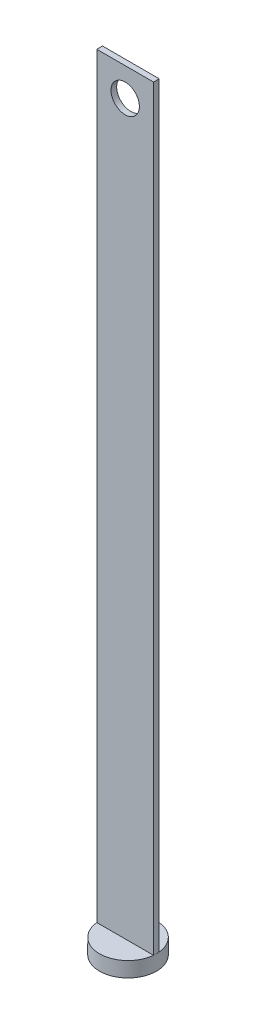
ISO-10303-21;
HEADER;
FILE_DESCRIPTION(('STEP AP214'),'2;1');
FILE_NAME('part.step','',(''),(''),'','','');
FILE_SCHEMA(('AUTOMOTIVE_DESIGN { 1 0 10303 214 1 1 1 1 }'));
ENDSEC;
DATA;
#1=APPLICATION_CONTEXT('core data for automotive mechanical design processes');
#2=APPLICATION_PROTOCOL_DEFINITION('international standard','automotive_design',2000,#1);
#3=PRODUCT_CONTEXT('',#1,'mechanical');
#4=PRODUCT('Part','Part','',(#3));
#5=PRODUCT_RELATED_PRODUCT_CATEGORY('part','',(#4));
#6=PRODUCT_DEFINITION_FORMATION('','',#4);
#7=PRODUCT_DEFINITION_CONTEXT('part definition',#1,'design');
#8=PRODUCT_DEFINITION('design','',#6,#7);
#9=PRODUCT_DEFINITION_SHAPE('','',#8);
#10=(LENGTH_UNIT() NAMED_UNIT(*) SI_UNIT(.MILLI.,.METRE.));
#11=(NAMED_UNIT(*) PLANE_ANGLE_UNIT() SI_UNIT($,.RADIAN.));
#12=(NAMED_UNIT(*) SI_UNIT($,.STERADIAN.) SOLID_ANGLE_UNIT());
#13=UNCERTAINTY_MEASURE_WITH_UNIT(LENGTH_MEASURE(1.E-05),#10,'distance_accuracy_value','');
#14=(GEOMETRIC_REPRESENTATION_CONTEXT(3) GLOBAL_UNCERTAINTY_ASSIGNED_CONTEXT((#13)) GLOBAL_UNIT_ASSIGNED_CONTEXT((#10,
#11,#12)) REPRESENTATION_CONTEXT('',''));
#15=CARTESIAN_POINT('',(0.,0.,0.));
#16=DIRECTION('',(0.,0.,1.));
#17=DIRECTION('',(1.,0.,0.));
#18=AXIS2_PLACEMENT_3D('',#15,#16,#17);
#19=CARTESIAN_POINT('',(-222.813580857681,446.46274670861,3.));
#20=DIRECTION('',(1.,0.,0.));
#21=DIRECTION('',(0.,1.,0.));
#22=AXIS2_PLACEMENT_3D('',#19,#20,#21);
#23=PLANE('',#22);
#24=DIRECTION('',(0.,-1.,0.));
#25=VECTOR('',#24,1.);
#26=CARTESIAN_POINT('',(-222.813580857681,446.46274670861,0.));
#27=LINE('',#26,#25);
#28=CARTESIAN_POINT('',(-222.813580857681,446.46274670861,0.));
#29=VERTEX_POINT('',#28);
#30=CARTESIAN_POINT('',(-222.813580857681,46.4627467086098,0.));
#31=VERTEX_POINT('',#30);
#32=EDGE_CURVE('E82',#29,#31,#27,.T.);
#33=ORIENTED_EDGE('',*,*,#32,.T.);
#34=DIRECTION('',(0.,0.,-1.));
#35=VECTOR('',#34,1.);
#36=CARTESIAN_POINT('',(-222.813580857681,46.4627467086098,3.));
#37=LINE('',#36,#35);
#38=CARTESIAN_POINT('',(-222.813580857681,46.4627467086098,3.));
#39=VERTEX_POINT('',#38);
#40=EDGE_CURVE('E11',#39,#31,#37,.T.);
#41=ORIENTED_EDGE('',*,*,#40,.F.);
#42=DIRECTION('',(0.,-1.,0.));
#43=VECTOR('',#42,1.);
#44=CARTESIAN_POINT('',(-222.813580857681,446.46274670861,3.));
#45=LINE('',#44,#43);
#46=CARTESIAN_POINT('',(-222.813580857681,446.46274670861,3.));
#47=VERTEX_POINT('',#46);
#48=EDGE_CURVE('E76',#47,#39,#45,.T.);
#49=ORIENTED_EDGE('',*,*,#48,.F.);
#50=DIRECTION('',(0.,0.,-1.));
#51=VECTOR('',#50,1.);
#52=CARTESIAN_POINT('',(-222.813580857681,446.46274670861,3.));
#53=LINE('',#52,#51);
#54=EDGE_CURVE('E85',#47,#29,#53,.T.);
#55=ORIENTED_EDGE('',*,*,#54,.T.);
#56=EDGE_LOOP('',(#33,#41,#49,#55));
#57=FACE_BOUND('',#56,.T.);
#58=ADVANCED_FACE('F35',(#57),#23,.F.);
#59=CARTESIAN_POINT('',(-192.813580857681,446.46274670861,3.));
#60=DIRECTION('',(-1.,0.,0.));
#61=DIRECTION('',(0.,-1.,0.));
#62=AXIS2_PLACEMENT_3D('',#59,#60,#61);
#63=PLANE('',#62);
#64=DIRECTION('',(0.,1.,0.));
#65=VECTOR('',#64,1.);
#66=CARTESIAN_POINT('',(-192.813580857681,446.46274670861,0.));
#67=LINE('',#66,#65);
#68=CARTESIAN_POINT('',(-192.813580857681,46.4627467086098,0.));
#69=VERTEX_POINT('',#68);
#70=CARTESIAN_POINT('',(-192.813580857681,446.46274670861,0.));
#71=VERTEX_POINT('',#70);
#72=EDGE_CURVE('E65',#69,#71,#67,.T.);
#73=ORIENTED_EDGE('',*,*,#72,.T.);
#74=DIRECTION('',(0.,0.,-1.));
#75=VECTOR('',#74,1.);
#76=CARTESIAN_POINT('',(-192.813580857681,446.46274670861,3.));
#77=LINE('',#76,#75);
#78=CARTESIAN_POINT('',(-192.813580857681,446.46274670861,3.));
#79=VERTEX_POINT('',#78);
#80=EDGE_CURVE('E129',#79,#71,#77,.T.);
#81=ORIENTED_EDGE('',*,*,#80,.F.);
#82=DIRECTION('',(0.,1.,0.));
#83=VECTOR('',#82,1.);
#84=CARTESIAN_POINT('',(-192.813580857681,446.46274670861,3.));
#85=LINE('',#84,#83);
#86=CARTESIAN_POINT('',(-192.813580857681,46.4627467086098,3.));
#87=VERTEX_POINT('',#86);
#88=EDGE_CURVE('E123',#87,#79,#85,.T.);
#89=ORIENTED_EDGE('',*,*,#88,.F.);
#90=DIRECTION('',(0.,0.,-1.));
#91=VECTOR('',#90,1.);
#92=CARTESIAN_POINT('',(-192.813580857681,46.4627467086098,3.));
#93=LINE('',#92,#91);
#94=EDGE_CURVE('E43',#87,#69,#93,.T.);
#95=ORIENTED_EDGE('',*,*,#94,.T.);
#96=EDGE_LOOP('',(#73,#81,#89,#95));
#97=FACE_BOUND('',#96,.T.);
#98=ADVANCED_FACE('F132',(#97),#63,.F.);
#99=CARTESIAN_POINT('',(-222.813580857681,446.46274670861,3.));
#100=DIRECTION('',(0.,-1.,0.));
#101=DIRECTION('',(0.,0.,-1.));
#102=AXIS2_PLACEMENT_3D('',#99,#100,#101);
#103=PLANE('',#102);
#104=DIRECTION('',(-1.,0.,0.));
#105=VECTOR('',#104,1.);
#106=CARTESIAN_POINT('',(-222.813580857681,446.46274670861,0.));
#107=LINE('',#106,#105);
#108=EDGE_CURVE('E71',#71,#29,#107,.T.);
#109=ORIENTED_EDGE('',*,*,#108,.T.);
#110=ORIENTED_EDGE('',*,*,#54,.F.);
#111=DIRECTION('',(-1.,0.,0.));
#112=VECTOR('',#111,1.);
#113=CARTESIAN_POINT('',(-222.813580857681,446.46274670861,3.));
#114=LINE('',#113,#112);
#115=EDGE_CURVE('E51',#79,#47,#114,.T.);
#116=ORIENTED_EDGE('',*,*,#115,.F.);
#117=ORIENTED_EDGE('',*,*,#80,.T.);
#118=EDGE_LOOP('',(#109,#110,#116,#117));
#119=FACE_BOUND('',#118,.T.);
#120=ADVANCED_FACE('F138',(#119),#103,.F.);
#121=CARTESIAN_POINT('',(0.,0.,3.));
#122=DIRECTION('',(0.,0.,1.));
#123=DIRECTION('',(1.,0.,0.));
#124=AXIS2_PLACEMENT_3D('',#121,#122,#123);
#125=PLANE('',#124);
#126=CARTESIAN_POINT('',(-207.813580857681,431.46274670861,3.));
#127=DIRECTION('',(0.,0.,1.));
#128=DIRECTION('',(1.,0.,0.));
#129=AXIS2_PLACEMENT_3D('',#126,#127,#128);
#130=CIRCLE('',#129,7.50000000000001);
#131=CARTESIAN_POINT('',(-200.313580857681,431.46274670861,3.));
#132=VERTEX_POINT('',#131);
#133=EDGE_CURVE('E117',#132,#132,#130,.T.);
#134=ORIENTED_EDGE('',*,*,#133,.F.);
#135=EDGE_LOOP('',(#134));
#136=FACE_BOUND('',#135,.T.);
#137=ORIENTED_EDGE('',*,*,#48,.T.);
#138=DIRECTION('',(1.,0.,0.));
#139=VECTOR('',#138,1.);
#140=CARTESIAN_POINT('',(-222.813580857681,46.4627467086098,3.));
#141=LINE('',#140,#139);
#142=EDGE_CURVE('E121',#39,#87,#141,.T.);
#143=ORIENTED_EDGE('',*,*,#142,.T.);
#144=ORIENTED_EDGE('',*,*,#88,.T.);
#145=ORIENTED_EDGE('',*,*,#115,.T.);
#146=EDGE_LOOP('',(#137,#143,#144,#145));
#147=FACE_BOUND('',#146,.T.);
#148=ADVANCED_FACE('F137',(#136,#147),#125,.T.);
#149=CARTESIAN_POINT('',(0.,0.,0.));
#150=DIRECTION('',(0.,0.,1.));
#151=DIRECTION('',(1.,0.,0.));
#152=AXIS2_PLACEMENT_3D('',#149,#150,#151);
#153=PLANE('',#152);
#154=CARTESIAN_POINT('',(-207.813580857681,431.46274670861,0.));
#155=DIRECTION('',(0.,0.,1.));
#156=DIRECTION('',(1.,0.,0.));
#157=AXIS2_PLACEMENT_3D('',#154,#155,#156);
#158=CIRCLE('',#157,7.50000000000001);
#159=CARTESIAN_POINT('',(-200.313580857681,431.46274670861,0.));
#160=VERTEX_POINT('',#159);
#161=EDGE_CURVE('E88',#160,#160,#158,.T.);
#162=ORIENTED_EDGE('',*,*,#161,.T.);
#163=EDGE_LOOP('',(#162));
#164=FACE_BOUND('',#163,.T.);
#165=ORIENTED_EDGE('',*,*,#32,.F.);
#166=ORIENTED_EDGE('',*,*,#108,.F.);
#167=ORIENTED_EDGE('',*,*,#72,.F.);
#168=DIRECTION('',(1.,0.,0.));
#169=VECTOR('',#168,1.);
#170=CARTESIAN_POINT('',(-222.813580857681,46.4627467086098,0.));
#171=LINE('',#170,#169);
#172=EDGE_CURVE('E87',#31,#69,#171,.T.);
#173=ORIENTED_EDGE('',*,*,#172,.F.);
#174=EDGE_LOOP('',(#165,#166,#167,#173));
#175=FACE_BOUND('',#174,.T.);
#176=ADVANCED_FACE('F91',(#164,#175),#153,.F.);
#177=CARTESIAN_POINT('',(-207.813580857681,431.46274670861,0.));
#178=DIRECTION('',(0.,0.,1.));
#179=DIRECTION('',(1.,0.,0.));
#180=AXIS2_PLACEMENT_3D('',#177,#178,#179);
#181=CYLINDRICAL_SURFACE('',#180,7.50000000000001);
#182=ORIENTED_EDGE('',*,*,#161,.F.);
#183=EDGE_LOOP('',(#182));
#184=FACE_BOUND('',#183,.T.);
#185=ORIENTED_EDGE('',*,*,#133,.T.);
#186=EDGE_LOOP('',(#185));
#187=FACE_BOUND('',#186,.T.);
#188=ADVANCED_FACE('F173',(#184,#187),#181,.F.);
#189=CARTESIAN_POINT('',(-207.813580857681,46.4627467086098,1.5));
#190=DIRECTION('',(0.,-1.,0.));
#191=DIRECTION('',(0.,0.,-1.));
#192=AXIS2_PLACEMENT_3D('',#189,#190,#191);
#193=PLANE('',#192);
#194=ORIENTED_EDGE('',*,*,#94,.F.);
#195=CARTESIAN_POINT('',(-207.813580857681,46.4627467086098,1.5));
#196=DIRECTION('',(0.,-1.,0.));
#197=DIRECTION('',(0.,0.,-1.));
#198=AXIS2_PLACEMENT_3D('',#195,#196,#197);
#199=CIRCLE('',#198,15.0748134316813);
#200=EDGE_CURVE('E108',#69,#87,#199,.T.);
#201=ORIENTED_EDGE('',*,*,#200,.F.);
#202=EDGE_LOOP('',(#194,#201));
#203=FACE_BOUND('',#202,.T.);
#204=ADVANCED_FACE('F134',(#203),#193,.F.);
#205=ORIENTED_EDGE('',*,*,#142,.F.);
#206=EDGE_CURVE('E111',#87,#39,#199,.T.);
#207=ORIENTED_EDGE('',*,*,#206,.F.);
#208=EDGE_LOOP('',(#205,#207));
#209=FACE_BOUND('',#208,.T.);
#210=ADVANCED_FACE('F136',(#209),#193,.F.);
#211=EDGE_CURVE('E102',#31,#69,#199,.T.);
#212=ORIENTED_EDGE('',*,*,#211,.F.);
#213=ORIENTED_EDGE('',*,*,#172,.T.);
#214=EDGE_LOOP('',(#212,#213));
#215=FACE_BOUND('',#214,.T.);
#216=ADVANCED_FACE('F103',(#215),#193,.F.);
#217=CARTESIAN_POINT('',(-207.813580857681,38.4627467086098,1.5));
#218=DIRECTION('',(0.,1.,0.));
#219=DIRECTION('',(0.,0.,1.));
#220=AXIS2_PLACEMENT_3D('',#217,#218,#219);
#221=CYLINDRICAL_SURFACE('',#220,15.0748134316813);
#222=CARTESIAN_POINT('',(-207.813580857681,38.4627467086098,1.5));
#223=DIRECTION('',(0.,-1.,0.));
#224=DIRECTION('',(0.,0.,-1.));
#225=AXIS2_PLACEMENT_3D('',#222,#223,#224);
#226=CIRCLE('',#225,15.0748134316813);
#227=CARTESIAN_POINT('',(-207.813580857681,38.4627467086098,-13.5748134316813));
#228=VERTEX_POINT('',#227);
#229=EDGE_CURVE('E114',#228,#228,#226,.T.);
#230=ORIENTED_EDGE('',*,*,#229,.F.);
#231=EDGE_LOOP('',(#230));
#232=FACE_BOUND('',#231,.T.);
#233=ORIENTED_EDGE('',*,*,#200,.T.);
#234=ORIENTED_EDGE('',*,*,#206,.T.);
#235=EDGE_CURVE('E100',#39,#31,#199,.T.);
#236=ORIENTED_EDGE('',*,*,#235,.T.);
#237=ORIENTED_EDGE('',*,*,#211,.T.);
#238=EDGE_LOOP('',(#233,#234,#236,#237));
#239=FACE_BOUND('',#238,.T.);
#240=ADVANCED_FACE('F109',(#232,#239),#221,.T.);
#241=CARTESIAN_POINT('',(-207.813580857681,38.4627467086098,1.5));
#242=DIRECTION('',(0.,-1.,0.));
#243=DIRECTION('',(0.,0.,-1.));
#244=AXIS2_PLACEMENT_3D('',#241,#242,#243);
#245=PLANE('',#244);
#246=ORIENTED_EDGE('',*,*,#229,.T.);
#247=EDGE_LOOP('',(#246));
#248=FACE_BOUND('',#247,.T.);
#249=ADVANCED_FACE('F205',(#248),#245,.T.);
#250=ORIENTED_EDGE('',*,*,#235,.F.);
#251=ORIENTED_EDGE('',*,*,#40,.T.);
#252=EDGE_LOOP('',(#250,#251));
#253=FACE_BOUND('',#252,.T.);
#254=ADVANCED_FACE('F98',(#253),#193,.F.);
#255=CLOSED_SHELL('',(#58,#98,#120,#148,#176,#188,#204,#210,#216,#240,#249,#254));
#256=MANIFOLD_SOLID_BREP('B2',#255);
#257=ADVANCED_BREP_SHAPE_REPRESENTATION('',(#18,#256),#14);
#258=SHAPE_DEFINITION_REPRESENTATION(#9,#257);
ENDSEC;
END-ISO-10303-21;
